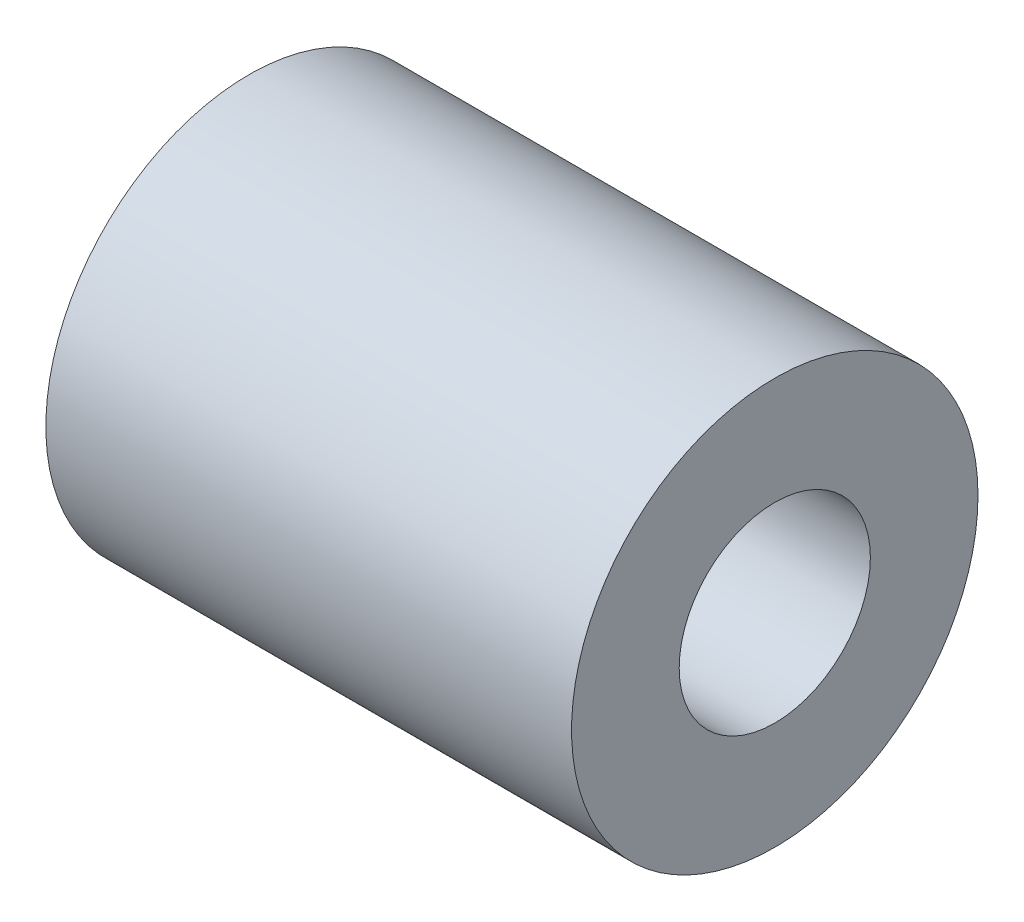
ISO-10303-21;
HEADER;
FILE_DESCRIPTION(('STEP AP214'),'2;1');
FILE_NAME('part.step','',(''),(''),'','','');
FILE_SCHEMA(('AUTOMOTIVE_DESIGN { 1 0 10303 214 1 1 1 1 }'));
ENDSEC;
DATA;
#1=APPLICATION_CONTEXT('core data for automotive mechanical design processes');
#2=APPLICATION_PROTOCOL_DEFINITION('international standard','automotive_design',2000,#1);
#3=PRODUCT_CONTEXT('',#1,'mechanical');
#4=PRODUCT('Part','Part','',(#3));
#5=PRODUCT_RELATED_PRODUCT_CATEGORY('part','',(#4));
#6=PRODUCT_DEFINITION_FORMATION('','',#4);
#7=PRODUCT_DEFINITION_CONTEXT('part definition',#1,'design');
#8=PRODUCT_DEFINITION('design','',#6,#7);
#9=PRODUCT_DEFINITION_SHAPE('','',#8);
#10=(LENGTH_UNIT() NAMED_UNIT(*) SI_UNIT(.MILLI.,.METRE.));
#11=(NAMED_UNIT(*) PLANE_ANGLE_UNIT() SI_UNIT($,.RADIAN.));
#12=(NAMED_UNIT(*) SI_UNIT($,.STERADIAN.) SOLID_ANGLE_UNIT());
#13=UNCERTAINTY_MEASURE_WITH_UNIT(LENGTH_MEASURE(1.E-05),#10,'distance_accuracy_value','');
#14=(GEOMETRIC_REPRESENTATION_CONTEXT(3) GLOBAL_UNCERTAINTY_ASSIGNED_CONTEXT((#13)) GLOBAL_UNIT_ASSIGNED_CONTEXT((#10,
#11,#12)) REPRESENTATION_CONTEXT('',''));
#15=CARTESIAN_POINT('',(0.,0.,0.));
#16=DIRECTION('',(0.,0.,1.));
#17=DIRECTION('',(1.,0.,0.));
#18=AXIS2_PLACEMENT_3D('',#15,#16,#17);
#19=CARTESIAN_POINT('',(17.4625,6.35,0.));
#20=DIRECTION('',(1.,0.,0.));
#21=DIRECTION('',(0.,0.,-1.));
#22=AXIS2_PLACEMENT_3D('',#19,#20,#21);
#23=PLANE('',#22);
#24=CARTESIAN_POINT('',(17.4625,0.,0.));
#25=DIRECTION('',(1.,0.,0.));
#26=DIRECTION('',(0.,0.,-1.));
#27=AXIS2_PLACEMENT_3D('',#24,#25,#26);
#28=CIRCLE('',#27,13.5001);
#29=CARTESIAN_POINT('',(17.4625,0.,-13.5001));
#30=VERTEX_POINT('',#29);
#31=EDGE_CURVE('E10',#30,#30,#28,.T.);
#32=ORIENTED_EDGE('',*,*,#31,.T.);
#33=EDGE_LOOP('',(#32));
#34=FACE_BOUND('',#33,.T.);
#35=CARTESIAN_POINT('',(17.4625,0.,0.));
#36=DIRECTION('',(1.,0.,0.));
#37=DIRECTION('',(0.,0.,-1.));
#38=AXIS2_PLACEMENT_3D('',#35,#36,#37);
#39=CIRCLE('',#38,6.35);
#40=CARTESIAN_POINT('',(17.4625,0.,-6.35));
#41=VERTEX_POINT('',#40);
#42=EDGE_CURVE('E50',#41,#41,#39,.T.);
#43=ORIENTED_EDGE('',*,*,#42,.F.);
#44=EDGE_LOOP('',(#43));
#45=FACE_BOUND('',#44,.T.);
#46=ADVANCED_FACE('F36',(#34,#45),#23,.T.);
#47=CARTESIAN_POINT('',(-17.4625,0.,0.));
#48=DIRECTION('',(1.,0.,0.));
#49=DIRECTION('',(0.,0.,-1.));
#50=AXIS2_PLACEMENT_3D('',#47,#48,#49);
#51=CYLINDRICAL_SURFACE('',#50,13.5001);
#52=CARTESIAN_POINT('',(-17.4625,0.,0.));
#53=DIRECTION('',(1.,0.,0.));
#54=DIRECTION('',(0.,0.,-1.));
#55=AXIS2_PLACEMENT_3D('',#52,#53,#54);
#56=CIRCLE('',#55,13.5001);
#57=CARTESIAN_POINT('',(-17.4625,0.,-13.5001));
#58=VERTEX_POINT('',#57);
#59=EDGE_CURVE('E42',#58,#58,#56,.T.);
#60=ORIENTED_EDGE('',*,*,#59,.T.);
#61=EDGE_LOOP('',(#60));
#62=FACE_BOUND('',#61,.T.);
#63=ORIENTED_EDGE('',*,*,#31,.F.);
#64=EDGE_LOOP('',(#63));
#65=FACE_BOUND('',#64,.T.);
#66=ADVANCED_FACE('F60',(#62,#65),#51,.T.);
#67=CARTESIAN_POINT('',(-17.4625,13.5001,0.));
#68=DIRECTION('',(-1.,0.,0.));
#69=DIRECTION('',(0.,0.,1.));
#70=AXIS2_PLACEMENT_3D('',#67,#68,#69);
#71=PLANE('',#70);
#72=CARTESIAN_POINT('',(-17.4625,0.,0.));
#73=DIRECTION('',(1.,0.,0.));
#74=DIRECTION('',(0.,0.,-1.));
#75=AXIS2_PLACEMENT_3D('',#72,#73,#74);
#76=CIRCLE('',#75,6.35);
#77=CARTESIAN_POINT('',(-17.4625,0.,-6.35));
#78=VERTEX_POINT('',#77);
#79=EDGE_CURVE('E46',#78,#78,#76,.T.);
#80=ORIENTED_EDGE('',*,*,#79,.T.);
#81=EDGE_LOOP('',(#80));
#82=FACE_BOUND('',#81,.T.);
#83=ORIENTED_EDGE('',*,*,#59,.F.);
#84=EDGE_LOOP('',(#83));
#85=FACE_BOUND('',#84,.T.);
#86=ADVANCED_FACE('F64',(#82,#85),#71,.T.);
#87=CARTESIAN_POINT('',(-17.4625,0.,0.));
#88=DIRECTION('',(1.,0.,0.));
#89=DIRECTION('',(0.,0.,-1.));
#90=AXIS2_PLACEMENT_3D('',#87,#88,#89);
#91=CYLINDRICAL_SURFACE('',#90,6.35);
#92=ORIENTED_EDGE('',*,*,#42,.T.);
#93=EDGE_LOOP('',(#92));
#94=FACE_BOUND('',#93,.T.);
#95=ORIENTED_EDGE('',*,*,#79,.F.);
#96=EDGE_LOOP('',(#95));
#97=FACE_BOUND('',#96,.T.);
#98=ADVANCED_FACE('F56',(#94,#97),#91,.F.);
#99=CLOSED_SHELL('',(#46,#66,#86,#98));
#100=MANIFOLD_SOLID_BREP('B2',#99);
#101=ADVANCED_BREP_SHAPE_REPRESENTATION('',(#18,#100),#14);
#102=SHAPE_DEFINITION_REPRESENTATION(#9,#101);
ENDSEC;
END-ISO-10303-21;
